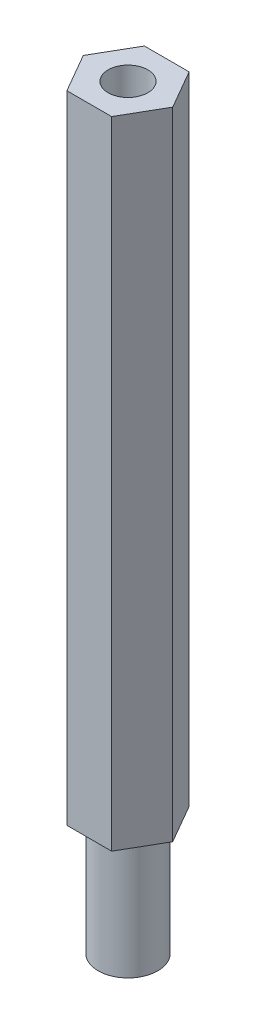
ISO-10303-21;
HEADER;
FILE_DESCRIPTION(('STEP AP214'),'2;1');
FILE_NAME('part.step','',(''),(''),'','','');
FILE_SCHEMA(('AUTOMOTIVE_DESIGN { 1 0 10303 214 1 1 1 1 }'));
ENDSEC;
DATA;
#1=APPLICATION_CONTEXT('core data for automotive mechanical design processes');
#2=APPLICATION_PROTOCOL_DEFINITION('international standard','automotive_design',2000,#1);
#3=PRODUCT_CONTEXT('',#1,'mechanical');
#4=PRODUCT('Part','Part','',(#3));
#5=PRODUCT_RELATED_PRODUCT_CATEGORY('part','',(#4));
#6=PRODUCT_DEFINITION_FORMATION('','',#4);
#7=PRODUCT_DEFINITION_CONTEXT('part definition',#1,'design');
#8=PRODUCT_DEFINITION('design','',#6,#7);
#9=PRODUCT_DEFINITION_SHAPE('','',#8);
#10=(LENGTH_UNIT() NAMED_UNIT(*) SI_UNIT(.MILLI.,.METRE.));
#11=(NAMED_UNIT(*) PLANE_ANGLE_UNIT() SI_UNIT($,.RADIAN.));
#12=(NAMED_UNIT(*) SI_UNIT($,.STERADIAN.) SOLID_ANGLE_UNIT());
#13=UNCERTAINTY_MEASURE_WITH_UNIT(LENGTH_MEASURE(1.E-05),#10,'distance_accuracy_value','');
#14=(GEOMETRIC_REPRESENTATION_CONTEXT(3) GLOBAL_UNCERTAINTY_ASSIGNED_CONTEXT((#13)) GLOBAL_UNIT_ASSIGNED_CONTEXT((#10,
#11,#12)) REPRESENTATION_CONTEXT('',''));
#15=CARTESIAN_POINT('',(0.,0.,0.));
#16=DIRECTION('',(0.,0.,1.));
#17=DIRECTION('',(1.,0.,0.));
#18=AXIS2_PLACEMENT_3D('',#15,#16,#17);
#19=CARTESIAN_POINT('',(1.12500000000002,32.,1.94855715851497));
#20=DIRECTION('',(-0.866025403784441,0.,-0.499999999999995));
#21=DIRECTION('',(-0.499999999999995,0.,0.866025403784442));
#22=AXIS2_PLACEMENT_3D('',#19,#20,#21);
#23=PLANE('',#22);
#24=DIRECTION('',(0.499999999999995,0.,-0.866025403784441));
#25=VECTOR('',#24,1.);
#26=CARTESIAN_POINT('',(1.12500000000002,0.,1.94855715851497));
#27=LINE('',#26,#25);
#28=CARTESIAN_POINT('',(1.12500000000002,0.,1.94855715851497));
#29=VERTEX_POINT('',#28);
#30=CARTESIAN_POINT('',(2.25,0.,0.));
#31=VERTEX_POINT('',#30);
#32=EDGE_CURVE('E125',#29,#31,#27,.T.);
#33=ORIENTED_EDGE('',*,*,#32,.T.);
#34=DIRECTION('',(0.,-1.,0.));
#35=VECTOR('',#34,1.);
#36=CARTESIAN_POINT('',(2.25,32.,0.));
#37=LINE('',#36,#35);
#38=CARTESIAN_POINT('',(2.25,32.,0.));
#39=VERTEX_POINT('',#38);
#40=EDGE_CURVE('E42',#39,#31,#37,.T.);
#41=ORIENTED_EDGE('',*,*,#40,.F.);
#42=DIRECTION('',(0.499999999999995,0.,-0.866025403784441));
#43=VECTOR('',#42,1.);
#44=CARTESIAN_POINT('',(1.12500000000002,32.,1.94855715851497));
#45=LINE('',#44,#43);
#46=CARTESIAN_POINT('',(1.12500000000002,32.,1.94855715851497));
#47=VERTEX_POINT('',#46);
#48=EDGE_CURVE('E136',#47,#39,#45,.T.);
#49=ORIENTED_EDGE('',*,*,#48,.F.);
#50=DIRECTION('',(0.,-1.,0.));
#51=VECTOR('',#50,1.);
#52=CARTESIAN_POINT('',(1.12500000000002,32.,1.94855715851497));
#53=LINE('',#52,#51);
#54=EDGE_CURVE('E121',#47,#29,#53,.T.);
#55=ORIENTED_EDGE('',*,*,#54,.T.);
#56=EDGE_LOOP('',(#33,#41,#49,#55));
#57=FACE_BOUND('',#56,.T.);
#58=ADVANCED_FACE('F39',(#57),#23,.F.);
#59=CARTESIAN_POINT('',(2.25,32.,0.));
#60=DIRECTION('',(-0.866025403784438,0.,0.500000000000001));
#61=DIRECTION('',(0.500000000000001,0.,0.866025403784438));
#62=AXIS2_PLACEMENT_3D('',#59,#60,#61);
#63=PLANE('',#62);
#64=DIRECTION('',(-0.500000000000001,0.,-0.866025403784438));
#65=VECTOR('',#64,1.);
#66=CARTESIAN_POINT('',(2.25,0.,0.));
#67=LINE('',#66,#65);
#68=CARTESIAN_POINT('',(1.125,0.,-1.94855715851499));
#69=VERTEX_POINT('',#68);
#70=EDGE_CURVE('E128',#31,#69,#67,.T.);
#71=ORIENTED_EDGE('',*,*,#70,.T.);
#72=DIRECTION('',(0.,-1.,0.));
#73=VECTOR('',#72,1.);
#74=CARTESIAN_POINT('',(1.125,32.,-1.94855715851499));
#75=LINE('',#74,#73);
#76=CARTESIAN_POINT('',(1.125,32.,-1.94855715851499));
#77=VERTEX_POINT('',#76);
#78=EDGE_CURVE('E139',#77,#69,#75,.T.);
#79=ORIENTED_EDGE('',*,*,#78,.F.);
#80=DIRECTION('',(-0.500000000000001,0.,-0.866025403784438));
#81=VECTOR('',#80,1.);
#82=CARTESIAN_POINT('',(2.25,32.,0.));
#83=LINE('',#82,#81);
#84=EDGE_CURVE('E94',#39,#77,#83,.T.);
#85=ORIENTED_EDGE('',*,*,#84,.F.);
#86=ORIENTED_EDGE('',*,*,#40,.T.);
#87=EDGE_LOOP('',(#71,#79,#85,#86));
#88=FACE_BOUND('',#87,.T.);
#89=ADVANCED_FACE('F144',(#88),#63,.F.);
#90=CARTESIAN_POINT('',(1.125,32.,-1.94855715851499));
#91=DIRECTION('',(0.,0.,1.));
#92=DIRECTION('',(1.,0.,0.));
#93=AXIS2_PLACEMENT_3D('',#90,#91,#92);
#94=PLANE('',#93);
#95=DIRECTION('',(-1.,0.,0.));
#96=VECTOR('',#95,1.);
#97=CARTESIAN_POINT('',(1.125,0.,-1.94855715851499));
#98=LINE('',#97,#96);
#99=CARTESIAN_POINT('',(-1.12500000000001,0.,-1.94855715851498));
#100=VERTEX_POINT('',#99);
#101=EDGE_CURVE('E131',#69,#100,#98,.T.);
#102=ORIENTED_EDGE('',*,*,#101,.T.);
#103=DIRECTION('',(0.,-1.,0.));
#104=VECTOR('',#103,1.);
#105=CARTESIAN_POINT('',(-1.12500000000001,32.,-1.94855715851498));
#106=LINE('',#105,#104);
#107=CARTESIAN_POINT('',(-1.12500000000001,32.,-1.94855715851498));
#108=VERTEX_POINT('',#107);
#109=EDGE_CURVE('E116',#108,#100,#106,.T.);
#110=ORIENTED_EDGE('',*,*,#109,.F.);
#111=DIRECTION('',(-1.,0.,0.));
#112=VECTOR('',#111,1.);
#113=CARTESIAN_POINT('',(1.125,32.,-1.94855715851499));
#114=LINE('',#113,#112);
#115=EDGE_CURVE('E107',#77,#108,#114,.T.);
#116=ORIENTED_EDGE('',*,*,#115,.F.);
#117=ORIENTED_EDGE('',*,*,#78,.T.);
#118=EDGE_LOOP('',(#102,#110,#116,#117));
#119=FACE_BOUND('',#118,.T.);
#120=ADVANCED_FACE('F150',(#119),#94,.F.);
#121=CARTESIAN_POINT('',(-1.12500000000001,32.,-1.94855715851498));
#122=DIRECTION('',(0.866025403784442,0.,0.499999999999995));
#123=DIRECTION('',(0.499999999999995,0.,-0.866025403784442));
#124=AXIS2_PLACEMENT_3D('',#121,#122,#123);
#125=PLANE('',#124);
#126=DIRECTION('',(-0.499999999999995,0.,0.866025403784442));
#127=VECTOR('',#126,1.);
#128=CARTESIAN_POINT('',(-1.12500000000001,0.,-1.94855715851498));
#129=LINE('',#128,#127);
#130=CARTESIAN_POINT('',(-2.25,0.,0.));
#131=VERTEX_POINT('',#130);
#132=EDGE_CURVE('E115',#100,#131,#129,.T.);
#133=ORIENTED_EDGE('',*,*,#132,.T.);
#134=DIRECTION('',(0.,-1.,0.));
#135=VECTOR('',#134,1.);
#136=CARTESIAN_POINT('',(-2.25,32.,0.));
#137=LINE('',#136,#135);
#138=CARTESIAN_POINT('',(-2.25,32.,0.));
#139=VERTEX_POINT('',#138);
#140=EDGE_CURVE('E112',#139,#131,#137,.T.);
#141=ORIENTED_EDGE('',*,*,#140,.F.);
#142=DIRECTION('',(-0.499999999999995,0.,0.866025403784442));
#143=VECTOR('',#142,1.);
#144=CARTESIAN_POINT('',(-1.12500000000001,32.,-1.94855715851498));
#145=LINE('',#144,#143);
#146=EDGE_CURVE('E101',#108,#139,#145,.T.);
#147=ORIENTED_EDGE('',*,*,#146,.F.);
#148=ORIENTED_EDGE('',*,*,#109,.T.);
#149=EDGE_LOOP('',(#133,#141,#147,#148));
#150=FACE_BOUND('',#149,.T.);
#151=ADVANCED_FACE('F113',(#150),#125,.F.);
#152=CARTESIAN_POINT('',(-2.25,32.,0.));
#153=DIRECTION('',(0.866025403784435,0.,-0.500000000000007));
#154=DIRECTION('',(-0.500000000000007,0.,-0.866025403784435));
#155=AXIS2_PLACEMENT_3D('',#152,#153,#154);
#156=PLANE('',#155);
#157=DIRECTION('',(0.500000000000007,0.,0.866025403784434));
#158=VECTOR('',#157,1.);
#159=CARTESIAN_POINT('',(-2.25,0.,0.));
#160=LINE('',#159,#158);
#161=CARTESIAN_POINT('',(-1.12499999999998,0.,1.948557158515));
#162=VERTEX_POINT('',#161);
#163=EDGE_CURVE('E79',#131,#162,#160,.T.);
#164=ORIENTED_EDGE('',*,*,#163,.T.);
#165=DIRECTION('',(0.,-1.,0.));
#166=VECTOR('',#165,1.);
#167=CARTESIAN_POINT('',(-1.12499999999998,32.,1.948557158515));
#168=LINE('',#167,#166);
#169=CARTESIAN_POINT('',(-1.12499999999998,32.,1.948557158515));
#170=VERTEX_POINT('',#169);
#171=EDGE_CURVE('E117',#170,#162,#168,.T.);
#172=ORIENTED_EDGE('',*,*,#171,.F.);
#173=DIRECTION('',(0.500000000000007,0.,0.866025403784434));
#174=VECTOR('',#173,1.);
#175=CARTESIAN_POINT('',(-2.25,32.,0.));
#176=LINE('',#175,#174);
#177=EDGE_CURVE('E105',#139,#170,#176,.T.);
#178=ORIENTED_EDGE('',*,*,#177,.F.);
#179=ORIENTED_EDGE('',*,*,#140,.T.);
#180=EDGE_LOOP('',(#164,#172,#178,#179));
#181=FACE_BOUND('',#180,.T.);
#182=ADVANCED_FACE('F119',(#181),#156,.F.);
#183=CARTESIAN_POINT('',(-1.12499999999998,32.,1.948557158515));
#184=DIRECTION('',(0.,0.,-1.));
#185=DIRECTION('',(-1.,0.,0.));
#186=AXIS2_PLACEMENT_3D('',#183,#184,#185);
#187=PLANE('',#186);
#188=DIRECTION('',(1.,0.,0.));
#189=VECTOR('',#188,1.);
#190=CARTESIAN_POINT('',(-1.12499999999998,0.,1.948557158515));
#191=LINE('',#190,#189);
#192=EDGE_CURVE('E85',#162,#29,#191,.T.);
#193=ORIENTED_EDGE('',*,*,#192,.T.);
#194=ORIENTED_EDGE('',*,*,#54,.F.);
#195=DIRECTION('',(1.,0.,0.));
#196=VECTOR('',#195,1.);
#197=CARTESIAN_POINT('',(-1.12499999999998,32.,1.948557158515));
#198=LINE('',#197,#196);
#199=EDGE_CURVE('E56',#170,#47,#198,.T.);
#200=ORIENTED_EDGE('',*,*,#199,.F.);
#201=ORIENTED_EDGE('',*,*,#171,.T.);
#202=EDGE_LOOP('',(#193,#194,#200,#201));
#203=FACE_BOUND('',#202,.T.);
#204=ADVANCED_FACE('F173',(#203),#187,.F.);
#205=CARTESIAN_POINT('',(0.,32.,0.));
#206=DIRECTION('',(0.,1.,0.));
#207=DIRECTION('',(0.,0.,1.));
#208=AXIS2_PLACEMENT_3D('',#205,#206,#207);
#209=PLANE('',#208);
#210=CARTESIAN_POINT('',(0.,32.,0.));
#211=DIRECTION('',(0.,1.,0.));
#212=DIRECTION('',(0.,0.,1.));
#213=AXIS2_PLACEMENT_3D('',#210,#211,#212);
#214=CIRCLE('',#213,1.);
#215=CARTESIAN_POINT('',(0.,32.,1.));
#216=VERTEX_POINT('',#215);
#217=EDGE_CURVE('E157',#216,#216,#214,.T.);
#218=ORIENTED_EDGE('',*,*,#217,.F.);
#219=EDGE_LOOP('',(#218));
#220=FACE_BOUND('',#219,.T.);
#221=ORIENTED_EDGE('',*,*,#48,.T.);
#222=ORIENTED_EDGE('',*,*,#84,.T.);
#223=ORIENTED_EDGE('',*,*,#115,.T.);
#224=ORIENTED_EDGE('',*,*,#146,.T.);
#225=ORIENTED_EDGE('',*,*,#177,.T.);
#226=ORIENTED_EDGE('',*,*,#199,.T.);
#227=EDGE_LOOP('',(#221,#222,#223,#224,#225,#226));
#228=FACE_BOUND('',#227,.T.);
#229=ADVANCED_FACE('F103',(#220,#228),#209,.T.);
#230=CARTESIAN_POINT('',(0.,0.,0.));
#231=DIRECTION('',(0.,1.,0.));
#232=DIRECTION('',(0.,0.,1.));
#233=AXIS2_PLACEMENT_3D('',#230,#231,#232);
#234=PLANE('',#233);
#235=CARTESIAN_POINT('',(0.,0.,0.));
#236=DIRECTION('',(0.,-1.,0.));
#237=DIRECTION('',(0.,0.,-1.));
#238=AXIS2_PLACEMENT_3D('',#235,#236,#237);
#239=CIRCLE('',#238,1.5);
#240=CARTESIAN_POINT('',(0.,0.,-1.5));
#241=VERTEX_POINT('',#240);
#242=EDGE_CURVE('E11',#241,#241,#239,.T.);
#243=ORIENTED_EDGE('',*,*,#242,.F.);
#244=EDGE_LOOP('',(#243));
#245=FACE_BOUND('',#244,.T.);
#246=ORIENTED_EDGE('',*,*,#32,.F.);
#247=ORIENTED_EDGE('',*,*,#192,.F.);
#248=ORIENTED_EDGE('',*,*,#163,.F.);
#249=ORIENTED_EDGE('',*,*,#132,.F.);
#250=ORIENTED_EDGE('',*,*,#101,.F.);
#251=ORIENTED_EDGE('',*,*,#70,.F.);
#252=EDGE_LOOP('',(#246,#247,#248,#249,#250,#251));
#253=FACE_BOUND('',#252,.T.);
#254=ADVANCED_FACE('F149',(#245,#253),#234,.F.);
#255=CARTESIAN_POINT('',(0.,-6.,0.));
#256=DIRECTION('',(0.,1.,0.));
#257=DIRECTION('',(0.,0.,1.));
#258=AXIS2_PLACEMENT_3D('',#255,#256,#257);
#259=CYLINDRICAL_SURFACE('',#258,1.5);
#260=CARTESIAN_POINT('',(0.,-6.,0.));
#261=DIRECTION('',(0.,-1.,0.));
#262=DIRECTION('',(0.,0.,-1.));
#263=AXIS2_PLACEMENT_3D('',#260,#261,#262);
#264=CIRCLE('',#263,1.5);
#265=CARTESIAN_POINT('',(0.,-6.,-1.5));
#266=VERTEX_POINT('',#265);
#267=EDGE_CURVE('E129',#266,#266,#264,.T.);
#268=ORIENTED_EDGE('',*,*,#267,.F.);
#269=EDGE_LOOP('',(#268));
#270=FACE_BOUND('',#269,.T.);
#271=ORIENTED_EDGE('',*,*,#242,.T.);
#272=EDGE_LOOP('',(#271));
#273=FACE_BOUND('',#272,.T.);
#274=ADVANCED_FACE('F179',(#270,#273),#259,.T.);
#275=CARTESIAN_POINT('',(0.,-6.,0.));
#276=DIRECTION('',(0.,-1.,0.));
#277=DIRECTION('',(0.,0.,-1.));
#278=AXIS2_PLACEMENT_3D('',#275,#276,#277);
#279=PLANE('',#278);
#280=ORIENTED_EDGE('',*,*,#267,.T.);
#281=EDGE_LOOP('',(#280));
#282=FACE_BOUND('',#281,.T.);
#283=ADVANCED_FACE('F168',(#282),#279,.T.);
#284=CARTESIAN_POINT('',(0.,22.,0.));
#285=DIRECTION('',(0.,1.,0.));
#286=DIRECTION('',(0.,0.,1.));
#287=AXIS2_PLACEMENT_3D('',#284,#285,#286);
#288=CYLINDRICAL_SURFACE('',#287,1.);
#289=CARTESIAN_POINT('',(0.,22.,0.));
#290=DIRECTION('',(0.,1.,0.));
#291=DIRECTION('',(0.,0.,1.));
#292=AXIS2_PLACEMENT_3D('',#289,#290,#291);
#293=CIRCLE('',#292,1.);
#294=CARTESIAN_POINT('',(0.,22.,1.));
#295=VERTEX_POINT('',#294);
#296=EDGE_CURVE('E156',#295,#295,#293,.T.);
#297=ORIENTED_EDGE('',*,*,#296,.F.);
#298=EDGE_LOOP('',(#297));
#299=FACE_BOUND('',#298,.T.);
#300=ORIENTED_EDGE('',*,*,#217,.T.);
#301=EDGE_LOOP('',(#300));
#302=FACE_BOUND('',#301,.T.);
#303=ADVANCED_FACE('F165',(#299,#302),#288,.F.);
#304=CARTESIAN_POINT('',(0.,22.,0.));
#305=DIRECTION('',(0.,1.,0.));
#306=DIRECTION('',(0.,0.,1.));
#307=AXIS2_PLACEMENT_3D('',#304,#305,#306);
#308=PLANE('',#307);
#309=ORIENTED_EDGE('',*,*,#296,.T.);
#310=EDGE_LOOP('',(#309));
#311=FACE_BOUND('',#310,.T.);
#312=ADVANCED_FACE('F163',(#311),#308,.T.);
#313=CLOSED_SHELL('',(#58,#89,#120,#151,#182,#204,#229,#254,#274,#283,#303,#312));
#314=MANIFOLD_SOLID_BREP('B2',#313);
#315=ADVANCED_BREP_SHAPE_REPRESENTATION('',(#18,#314),#14);
#316=SHAPE_DEFINITION_REPRESENTATION(#9,#315);
ENDSEC;
END-ISO-10303-21;
